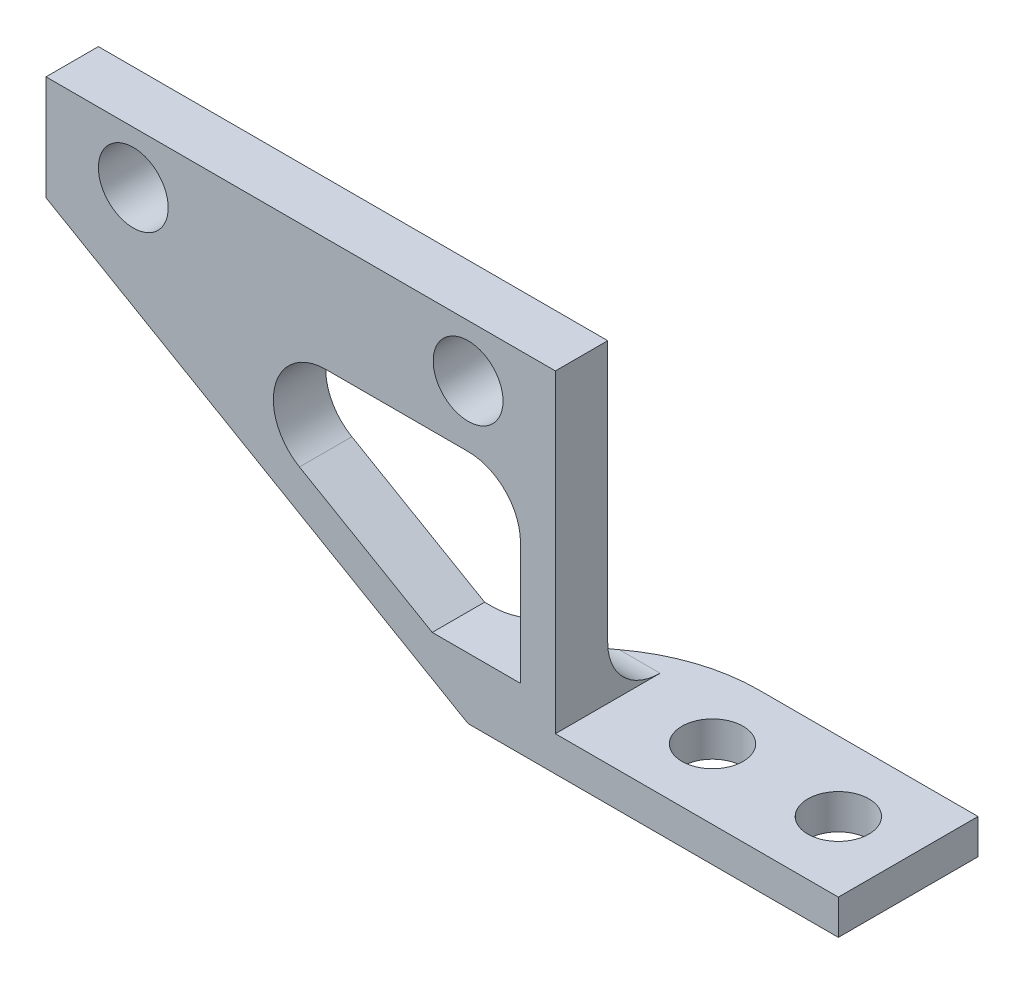
ISO-10303-21;
HEADER;
FILE_DESCRIPTION(('STEP AP214'),'2;1');
FILE_NAME('part.step','',(''),(''),'','','');
FILE_SCHEMA(('AUTOMOTIVE_DESIGN { 1 0 10303 214 1 1 1 1 }'));
ENDSEC;
DATA;
#1=APPLICATION_CONTEXT('core data for automotive mechanical design processes');
#2=APPLICATION_PROTOCOL_DEFINITION('international standard','automotive_design',2000,#1);
#3=PRODUCT_CONTEXT('',#1,'mechanical');
#4=PRODUCT('Part','Part','',(#3));
#5=PRODUCT_RELATED_PRODUCT_CATEGORY('part','',(#4));
#6=PRODUCT_DEFINITION_FORMATION('','',#4);
#7=PRODUCT_DEFINITION_CONTEXT('part definition',#1,'design');
#8=PRODUCT_DEFINITION('design','',#6,#7);
#9=PRODUCT_DEFINITION_SHAPE('','',#8);
#10=(LENGTH_UNIT() NAMED_UNIT(*) SI_UNIT(.MILLI.,.METRE.));
#11=(NAMED_UNIT(*) PLANE_ANGLE_UNIT() SI_UNIT($,.RADIAN.));
#12=(NAMED_UNIT(*) SI_UNIT($,.STERADIAN.) SOLID_ANGLE_UNIT());
#13=UNCERTAINTY_MEASURE_WITH_UNIT(LENGTH_MEASURE(1.E-05),#10,'distance_accuracy_value','');
#14=(GEOMETRIC_REPRESENTATION_CONTEXT(3) GLOBAL_UNCERTAINTY_ASSIGNED_CONTEXT((#13)) GLOBAL_UNIT_ASSIGNED_CONTEXT((#10,
#11,#12)) REPRESENTATION_CONTEXT('',''));
#15=CARTESIAN_POINT('',(0.,0.,0.));
#16=DIRECTION('',(0.,0.,1.));
#17=DIRECTION('',(1.,0.,0.));
#18=AXIS2_PLACEMENT_3D('',#15,#16,#17);
#19=CARTESIAN_POINT('',(0.,2.,0.));
#20=DIRECTION('',(0.,-1.,0.));
#21=DIRECTION('',(0.,0.,-1.));
#22=AXIS2_PLACEMENT_3D('',#19,#20,#21);
#23=PLANE('',#22);
#24=CARTESIAN_POINT('',(8.66025403784439,2.,2.));
#25=DIRECTION('',(0.,-1.,0.));
#26=DIRECTION('',(0.,0.,-1.));
#27=AXIS2_PLACEMENT_3D('',#24,#25,#26);
#28=CIRCLE('',#27,10.);
#29=CARTESIAN_POINT('',(8.66025403784439,2.,-8.));
#30=VERTEX_POINT('',#29);
#31=CARTESIAN_POINT('',(2.66025403784438,2.,-6.));
#32=VERTEX_POINT('',#31);
#33=EDGE_CURVE('E319',#30,#32,#28,.F.);
#34=ORIENTED_EDGE('',*,*,#33,.T.);
#35=DIRECTION('',(-1.,0.,0.));
#36=VECTOR('',#35,1.);
#37=CARTESIAN_POINT('',(5.,2.,-6.));
#38=LINE('',#37,#36);
#39=CARTESIAN_POINT('',(5.,2.,-6.));
#40=VERTEX_POINT('',#39);
#41=EDGE_CURVE('E345',#32,#40,#38,.F.);
#42=ORIENTED_EDGE('',*,*,#41,.T.);
#43=DIRECTION('',(0.,0.,1.));
#44=VECTOR('',#43,1.);
#45=CARTESIAN_POINT('',(5.,2.,0.));
#46=LINE('',#45,#44);
#47=CARTESIAN_POINT('',(5.,2.,0.));
#48=VERTEX_POINT('',#47);
#49=EDGE_CURVE('E256',#40,#48,#46,.T.);
#50=ORIENTED_EDGE('',*,*,#49,.T.);
#51=DIRECTION('',(1.,0.,0.));
#52=VECTOR('',#51,1.);
#53=CARTESIAN_POINT('',(0.,2.,0.));
#54=LINE('',#53,#52);
#55=CARTESIAN_POINT('',(21.21,2.,0.));
#56=VERTEX_POINT('',#55);
#57=EDGE_CURVE('E286',#48,#56,#54,.T.);
#58=ORIENTED_EDGE('',*,*,#57,.T.);
#59=DIRECTION('',(0.,0.,-1.));
#60=VECTOR('',#59,1.);
#61=CARTESIAN_POINT('',(21.21,2.,0.));
#62=LINE('',#61,#60);
#63=CARTESIAN_POINT('',(21.21,2.,-8.));
#64=VERTEX_POINT('',#63);
#65=EDGE_CURVE('E289',#56,#64,#62,.T.);
#66=ORIENTED_EDGE('',*,*,#65,.T.);
#67=DIRECTION('',(-1.,0.,0.));
#68=VECTOR('',#67,1.);
#69=CARTESIAN_POINT('',(0.,2.,-8.00000000000001));
#70=LINE('',#69,#68);
#71=EDGE_CURVE('E293',#64,#30,#70,.T.);
#72=ORIENTED_EDGE('',*,*,#71,.T.);
#73=EDGE_LOOP('',(#34,#42,#50,#58,#66,#72));
#74=FACE_BOUND('',#73,.T.);
#75=CARTESIAN_POINT('',(10.,2.,-4.));
#76=DIRECTION('',(0.,1.,0.));
#77=DIRECTION('',(0.,0.,1.));
#78=AXIS2_PLACEMENT_3D('',#75,#76,#77);
#79=CIRCLE('',#78,1.75);
#80=CARTESIAN_POINT('',(10.,2.,-2.25));
#81=VERTEX_POINT('',#80);
#82=EDGE_CURVE('E278',#81,#81,#79,.T.);
#83=ORIENTED_EDGE('',*,*,#82,.F.);
#84=EDGE_LOOP('',(#83));
#85=FACE_BOUND('',#84,.T.);
#86=CARTESIAN_POINT('',(17.21,2.,-4.));
#87=DIRECTION('',(0.,1.,0.));
#88=DIRECTION('',(0.,0.,1.));
#89=AXIS2_PLACEMENT_3D('',#86,#87,#88);
#90=CIRCLE('',#89,1.75);
#91=CARTESIAN_POINT('',(17.21,2.,-2.25));
#92=VERTEX_POINT('',#91);
#93=EDGE_CURVE('E270',#92,#92,#90,.T.);
#94=ORIENTED_EDGE('',*,*,#93,.F.);
#95=EDGE_LOOP('',(#94));
#96=FACE_BOUND('',#95,.T.);
#97=ADVANCED_FACE('F41',(#74,#85,#96),#23,.F.);
#98=CARTESIAN_POINT('',(0.,0.,0.));
#99=DIRECTION('',(0.,-1.,0.));
#100=DIRECTION('',(0.,0.,-1.));
#101=AXIS2_PLACEMENT_3D('',#98,#99,#100);
#102=PLANE('',#101);
#103=DIRECTION('',(0.,0.,1.));
#104=VECTOR('',#103,1.);
#105=CARTESIAN_POINT('',(0.,0.,-3.));
#106=LINE('',#105,#104);
#107=CARTESIAN_POINT('',(0.,0.,-3.4539455047096));
#108=VERTEX_POINT('',#107);
#109=CARTESIAN_POINT('',(0.,0.,0.));
#110=VERTEX_POINT('',#109);
#111=EDGE_CURVE('E67',#108,#110,#106,.T.);
#112=ORIENTED_EDGE('',*,*,#111,.F.);
#113=CARTESIAN_POINT('',(-1.58669672811521,0.,-6.));
#114=DIRECTION('',(0.,-1.,0.));
#115=DIRECTION('',(0.,0.,-1.));
#116=AXIS2_PLACEMENT_3D('',#113,#114,#115);
#117=CIRCLE('',#116,3.);
#118=CARTESIAN_POINT('',(0.777984217875463,0.,-4.15384615384616));
#119=VERTEX_POINT('',#118);
#120=EDGE_CURVE('E363',#108,#119,#117,.F.);
#121=ORIENTED_EDGE('',*,*,#120,.T.);
#122=CARTESIAN_POINT('',(8.66025403784439,0.,2.));
#123=DIRECTION('',(0.,-1.,0.));
#124=DIRECTION('',(0.,0.,-1.));
#125=AXIS2_PLACEMENT_3D('',#122,#123,#124);
#126=CIRCLE('',#125,10.);
#127=CARTESIAN_POINT('',(8.66025403784439,0.,-8.));
#128=VERTEX_POINT('',#127);
#129=EDGE_CURVE('E313',#119,#128,#126,.T.);
#130=ORIENTED_EDGE('',*,*,#129,.T.);
#131=DIRECTION('',(-1.,0.,0.));
#132=VECTOR('',#131,1.);
#133=CARTESIAN_POINT('',(0.,0.,-8.00000000000001));
#134=LINE('',#133,#132);
#135=CARTESIAN_POINT('',(21.21,0.,-8.));
#136=VERTEX_POINT('',#135);
#137=EDGE_CURVE('E290',#136,#128,#134,.T.);
#138=ORIENTED_EDGE('',*,*,#137,.F.);
#139=DIRECTION('',(0.,0.,-1.));
#140=VECTOR('',#139,1.);
#141=CARTESIAN_POINT('',(21.21,0.,0.));
#142=LINE('',#141,#140);
#143=CARTESIAN_POINT('',(21.21,0.,0.));
#144=VERTEX_POINT('',#143);
#145=EDGE_CURVE('E300',#144,#136,#142,.T.);
#146=ORIENTED_EDGE('',*,*,#145,.F.);
#147=DIRECTION('',(1.,0.,0.));
#148=VECTOR('',#147,1.);
#149=CARTESIAN_POINT('',(0.,0.,0.));
#150=LINE('',#149,#148);
#151=EDGE_CURVE('E282',#110,#144,#150,.T.);
#152=ORIENTED_EDGE('',*,*,#151,.F.);
#153=EDGE_LOOP('',(#112,#121,#130,#138,#146,#152));
#154=FACE_BOUND('',#153,.T.);
#155=CARTESIAN_POINT('',(10.,0.,-4.));
#156=DIRECTION('',(0.,1.,0.));
#157=DIRECTION('',(0.,0.,1.));
#158=AXIS2_PLACEMENT_3D('',#155,#156,#157);
#159=CIRCLE('',#158,1.75);
#160=CARTESIAN_POINT('',(10.,0.,-2.25));
#161=VERTEX_POINT('',#160);
#162=EDGE_CURVE('E274',#161,#161,#159,.T.);
#163=ORIENTED_EDGE('',*,*,#162,.T.);
#164=EDGE_LOOP('',(#163));
#165=FACE_BOUND('',#164,.T.);
#166=CARTESIAN_POINT('',(17.21,0.,-4.));
#167=DIRECTION('',(0.,1.,0.));
#168=DIRECTION('',(0.,0.,1.));
#169=AXIS2_PLACEMENT_3D('',#166,#167,#168);
#170=CIRCLE('',#169,1.75);
#171=CARTESIAN_POINT('',(17.21,0.,-2.25));
#172=VERTEX_POINT('',#171);
#173=EDGE_CURVE('E269',#172,#172,#170,.T.);
#174=ORIENTED_EDGE('',*,*,#173,.T.);
#175=EDGE_LOOP('',(#174));
#176=FACE_BOUND('',#175,.T.);
#177=ADVANCED_FACE('F405',(#154,#165,#176),#102,.T.);
#178=CARTESIAN_POINT('',(0.,2.,0.));
#179=DIRECTION('',(0.,0.,-1.));
#180=DIRECTION('',(-1.,0.,0.));
#181=AXIS2_PLACEMENT_3D('',#178,#179,#180);
#182=PLANE('',#181);
#183=ORIENTED_EDGE('',*,*,#57,.F.);
#184=DIRECTION('',(0.,1.,0.));
#185=VECTOR('',#184,1.);
#186=CARTESIAN_POINT('',(5.,0.,0.));
#187=LINE('',#186,#185);
#188=CARTESIAN_POINT('',(5.,20.,0.));
#189=VERTEX_POINT('',#188);
#190=EDGE_CURVE('E192',#48,#189,#187,.T.);
#191=ORIENTED_EDGE('',*,*,#190,.T.);
#192=DIRECTION('',(-1.,0.,0.));
#193=VECTOR('',#192,1.);
#194=CARTESIAN_POINT('',(5.,20.,0.));
#195=LINE('',#194,#193);
#196=CARTESIAN_POINT('',(-24.18,20.,0.));
#197=VERTEX_POINT('',#196);
#198=EDGE_CURVE('E244',#189,#197,#195,.T.);
#199=ORIENTED_EDGE('',*,*,#198,.T.);
#200=DIRECTION('',(0.,-1.,0.));
#201=VECTOR('',#200,1.);
#202=CARTESIAN_POINT('',(-24.18,20.,0.));
#203=LINE('',#202,#201);
#204=CARTESIAN_POINT('',(-24.18,14.,0.));
#205=VERTEX_POINT('',#204);
#206=EDGE_CURVE('E248',#197,#205,#203,.T.);
#207=ORIENTED_EDGE('',*,*,#206,.T.);
#208=DIRECTION('',(0.865409949190217,-0.50106448671063,0.));
#209=VECTOR('',#208,1.);
#210=CARTESIAN_POINT('',(0.,0.,0.));
#211=LINE('',#210,#209);
#212=EDGE_CURVE('E229',#205,#110,#211,.T.);
#213=ORIENTED_EDGE('',*,*,#212,.T.);
#214=ORIENTED_EDGE('',*,*,#151,.T.);
#215=DIRECTION('',(0.,-1.,0.));
#216=VECTOR('',#215,1.);
#217=CARTESIAN_POINT('',(21.21,2.,0.));
#218=LINE('',#217,#216);
#219=EDGE_CURVE('E309',#56,#144,#218,.T.);
#220=ORIENTED_EDGE('',*,*,#219,.F.);
#221=EDGE_LOOP('',(#183,#191,#199,#207,#213,#214,#220));
#222=FACE_BOUND('',#221,.T.);
#223=DIRECTION('',(1.,0.,0.));
#224=VECTOR('',#223,1.);
#225=CARTESIAN_POINT('',(3.,3.5,0.));
#226=LINE('',#225,#224);
#227=CARTESIAN_POINT('',(-2.05349780209025,3.5,0.));
#228=VERTEX_POINT('',#227);
#229=CARTESIAN_POINT('',(3.,3.5,0.));
#230=VERTEX_POINT('',#229);
#231=EDGE_CURVE('E212',#228,#230,#226,.T.);
#232=ORIENTED_EDGE('',*,*,#231,.F.);
#233=DIRECTION('',(0.865409949190217,-0.50106448671063,0.));
#234=VECTOR('',#233,1.);
#235=CARTESIAN_POINT('',(-2.05349780209025,3.5,0.));
#236=LINE('',#235,#234);
#237=CARTESIAN_POINT('',(-9.65943796535752,7.90377015242935,0.));
#238=VERTEX_POINT('',#237);
#239=EDGE_CURVE('E189',#238,#228,#236,.T.);
#240=ORIENTED_EDGE('',*,*,#239,.F.);
#241=CARTESIAN_POINT('',(-8.15624450522563,10.5,0.));
#242=DIRECTION('',(0.,0.,-1.));
#243=DIRECTION('',(-1.,0.,0.));
#244=AXIS2_PLACEMENT_3D('',#241,#242,#243);
#245=CIRCLE('',#244,3.);
#246=CARTESIAN_POINT('',(-8.15624450522563,13.5,0.));
#247=VERTEX_POINT('',#246);
#248=EDGE_CURVE('E355',#238,#247,#245,.T.);
#249=ORIENTED_EDGE('',*,*,#248,.T.);
#250=DIRECTION('',(-1.,0.,0.));
#251=VECTOR('',#250,1.);
#252=CARTESIAN_POINT('',(-19.3249263735188,13.5,0.));
#253=LINE('',#252,#251);
#254=CARTESIAN_POINT('',(0.,13.5,0.));
#255=VERTEX_POINT('',#254);
#256=EDGE_CURVE('E204',#255,#247,#253,.T.);
#257=ORIENTED_EDGE('',*,*,#256,.F.);
#258=CARTESIAN_POINT('',(0.,10.5,0.));
#259=DIRECTION('',(0.,0.,-1.));
#260=DIRECTION('',(-1.,0.,0.));
#261=AXIS2_PLACEMENT_3D('',#258,#259,#260);
#262=CIRCLE('',#261,3.);
#263=CARTESIAN_POINT('',(3.,10.5,0.));
#264=VERTEX_POINT('',#263);
#265=EDGE_CURVE('E349',#255,#264,#262,.T.);
#266=ORIENTED_EDGE('',*,*,#265,.T.);
#267=DIRECTION('',(0.,1.,0.));
#268=VECTOR('',#267,1.);
#269=CARTESIAN_POINT('',(3.,13.5,0.));
#270=LINE('',#269,#268);
#271=EDGE_CURVE('E215',#230,#264,#270,.T.);
#272=ORIENTED_EDGE('',*,*,#271,.F.);
#273=EDGE_LOOP('',(#232,#240,#249,#257,#266,#272));
#274=FACE_BOUND('',#273,.T.);
#275=CARTESIAN_POINT('',(-19.18,17.,0.));
#276=DIRECTION('',(0.,0.,1.));
#277=DIRECTION('',(1.,0.,0.));
#278=AXIS2_PLACEMENT_3D('',#275,#276,#277);
#279=CIRCLE('',#278,2.);
#280=CARTESIAN_POINT('',(-17.18,17.,0.));
#281=VERTEX_POINT('',#280);
#282=EDGE_CURVE('E207',#281,#281,#279,.T.);
#283=ORIENTED_EDGE('',*,*,#282,.F.);
#284=EDGE_LOOP('',(#283));
#285=FACE_BOUND('',#284,.T.);
#286=CARTESIAN_POINT('',(0.,17.,0.));
#287=DIRECTION('',(0.,0.,1.));
#288=DIRECTION('',(1.,0.,0.));
#289=AXIS2_PLACEMENT_3D('',#286,#287,#288);
#290=CIRCLE('',#289,2.);
#291=CARTESIAN_POINT('',(2.,17.,0.));
#292=VERTEX_POINT('',#291);
#293=EDGE_CURVE('E443',#292,#292,#290,.T.);
#294=ORIENTED_EDGE('',*,*,#293,.F.);
#295=EDGE_LOOP('',(#294));
#296=FACE_BOUND('',#295,.T.);
#297=ADVANCED_FACE('F388',(#222,#274,#285,#296),#182,.F.);
#298=CARTESIAN_POINT('',(21.21,2.,0.));
#299=DIRECTION('',(-1.,0.,0.));
#300=DIRECTION('',(0.,0.,1.));
#301=AXIS2_PLACEMENT_3D('',#298,#299,#300);
#302=PLANE('',#301);
#303=ORIENTED_EDGE('',*,*,#145,.T.);
#304=DIRECTION('',(0.,-1.,0.));
#305=VECTOR('',#304,1.);
#306=CARTESIAN_POINT('',(21.21,2.,-8.));
#307=LINE('',#306,#305);
#308=EDGE_CURVE('E297',#64,#136,#307,.T.);
#309=ORIENTED_EDGE('',*,*,#308,.F.);
#310=ORIENTED_EDGE('',*,*,#65,.F.);
#311=ORIENTED_EDGE('',*,*,#219,.T.);
#312=EDGE_LOOP('',(#303,#309,#310,#311));
#313=FACE_BOUND('',#312,.T.);
#314=ADVANCED_FACE('F419',(#313),#302,.F.);
#315=CARTESIAN_POINT('',(0.,2.,-8.00000000000001));
#316=DIRECTION('',(0.,0.,1.));
#317=DIRECTION('',(1.,0.,0.));
#318=AXIS2_PLACEMENT_3D('',#315,#316,#317);
#319=PLANE('',#318);
#320=ORIENTED_EDGE('',*,*,#137,.T.);
#321=DIRECTION('',(0.,-1.,0.));
#322=VECTOR('',#321,1.);
#323=CARTESIAN_POINT('',(8.66025403784439,2.,-8.));
#324=LINE('',#323,#322);
#325=EDGE_CURVE('E316',#128,#30,#324,.F.);
#326=ORIENTED_EDGE('',*,*,#325,.T.);
#327=ORIENTED_EDGE('',*,*,#71,.F.);
#328=ORIENTED_EDGE('',*,*,#308,.T.);
#329=EDGE_LOOP('',(#320,#326,#327,#328));
#330=FACE_BOUND('',#329,.T.);
#331=ADVANCED_FACE('F417',(#330),#319,.F.);
#332=CARTESIAN_POINT('',(10.,2.,-4.));
#333=DIRECTION('',(0.,-1.,0.));
#334=DIRECTION('',(0.,0.,-1.));
#335=AXIS2_PLACEMENT_3D('',#332,#333,#334);
#336=CYLINDRICAL_SURFACE('',#335,1.75);
#337=ORIENTED_EDGE('',*,*,#82,.T.);
#338=EDGE_LOOP('',(#337));
#339=FACE_BOUND('',#338,.T.);
#340=ORIENTED_EDGE('',*,*,#162,.F.);
#341=EDGE_LOOP('',(#340));
#342=FACE_BOUND('',#341,.T.);
#343=ADVANCED_FACE('F414',(#339,#342),#336,.F.);
#344=CARTESIAN_POINT('',(17.21,2.,-4.));
#345=DIRECTION('',(0.,-1.,0.));
#346=DIRECTION('',(0.,0.,-1.));
#347=AXIS2_PLACEMENT_3D('',#344,#345,#346);
#348=CYLINDRICAL_SURFACE('',#347,1.75);
#349=ORIENTED_EDGE('',*,*,#93,.T.);
#350=EDGE_LOOP('',(#349));
#351=FACE_BOUND('',#350,.T.);
#352=ORIENTED_EDGE('',*,*,#173,.F.);
#353=EDGE_LOOP('',(#352));
#354=FACE_BOUND('',#353,.T.);
#355=ADVANCED_FACE('F489',(#351,#354),#348,.F.);
#356=CARTESIAN_POINT('',(0.,0.,-3.));
#357=DIRECTION('',(0.,0.,1.));
#358=DIRECTION('',(1.,0.,0.));
#359=AXIS2_PLACEMENT_3D('',#356,#357,#358);
#360=PLANE('',#359);
#361=CARTESIAN_POINT('',(0.,17.,-3.));
#362=DIRECTION('',(0.,0.,1.));
#363=DIRECTION('',(1.,0.,0.));
#364=AXIS2_PLACEMENT_3D('',#361,#362,#363);
#365=CIRCLE('',#364,2.);
#366=CARTESIAN_POINT('',(2.,17.,-3.));
#367=VERTEX_POINT('',#366);
#368=EDGE_CURVE('E446',#367,#367,#365,.T.);
#369=ORIENTED_EDGE('',*,*,#368,.T.);
#370=EDGE_LOOP('',(#369));
#371=FACE_BOUND('',#370,.T.);
#372=CARTESIAN_POINT('',(-19.18,17.,-3.));
#373=DIRECTION('',(0.,0.,1.));
#374=DIRECTION('',(1.,0.,0.));
#375=AXIS2_PLACEMENT_3D('',#372,#373,#374);
#376=CIRCLE('',#375,2.);
#377=CARTESIAN_POINT('',(-17.18,17.,-3.));
#378=VERTEX_POINT('',#377);
#379=EDGE_CURVE('E216',#378,#378,#376,.T.);
#380=ORIENTED_EDGE('',*,*,#379,.T.);
#381=EDGE_LOOP('',(#380));
#382=FACE_BOUND('',#381,.T.);
#383=DIRECTION('',(1.,0.,0.));
#384=VECTOR('',#383,1.);
#385=CARTESIAN_POINT('',(3.,3.5,-3.));
#386=LINE('',#385,#384);
#387=CARTESIAN_POINT('',(-2.05349780209025,3.5,-3.));
#388=VERTEX_POINT('',#387);
#389=CARTESIAN_POINT('',(-1.58669672811521,3.5,-3.));
#390=VERTEX_POINT('',#389);
#391=EDGE_CURVE('E174',#388,#390,#386,.T.);
#392=ORIENTED_EDGE('',*,*,#391,.T.);
#393=DIRECTION('',(0.,-1.,0.));
#394=VECTOR('',#393,1.);
#395=CARTESIAN_POINT('',(-1.58669672811521,0.,-3.));
#396=LINE('',#395,#394);
#397=CARTESIAN_POINT('',(-1.58669672811521,0.918682969132051,-3.));
#398=VERTEX_POINT('',#397);
#399=EDGE_CURVE('E339',#390,#398,#396,.T.);
#400=ORIENTED_EDGE('',*,*,#399,.T.);
#401=DIRECTION('',(0.865409949190217,-0.50106448671063,0.));
#402=VECTOR('',#401,1.);
#403=CARTESIAN_POINT('',(0.,0.,-3.));
#404=LINE('',#403,#402);
#405=CARTESIAN_POINT('',(-24.18,14.,-3.));
#406=VERTEX_POINT('',#405);
#407=EDGE_CURVE('E237',#406,#398,#404,.T.);
#408=ORIENTED_EDGE('',*,*,#407,.F.);
#409=DIRECTION('',(0.,-1.,0.));
#410=VECTOR('',#409,1.);
#411=CARTESIAN_POINT('',(-24.18,20.,-3.));
#412=LINE('',#411,#410);
#413=CARTESIAN_POINT('',(-24.18,20.,-3.));
#414=VERTEX_POINT('',#413);
#415=EDGE_CURVE('E233',#414,#406,#412,.T.);
#416=ORIENTED_EDGE('',*,*,#415,.F.);
#417=DIRECTION('',(-1.,0.,0.));
#418=VECTOR('',#417,1.);
#419=CARTESIAN_POINT('',(5.,20.,-3.));
#420=LINE('',#419,#418);
#421=CARTESIAN_POINT('',(5.,20.,-3.));
#422=VERTEX_POINT('',#421);
#423=EDGE_CURVE('E228',#422,#414,#420,.T.);
#424=ORIENTED_EDGE('',*,*,#423,.F.);
#425=DIRECTION('',(0.,1.,0.));
#426=VECTOR('',#425,1.);
#427=CARTESIAN_POINT('',(5.,0.,-3.));
#428=LINE('',#427,#426);
#429=CARTESIAN_POINT('',(5.,5.,-3.));
#430=VERTEX_POINT('',#429);
#431=EDGE_CURVE('E225',#430,#422,#428,.T.);
#432=ORIENTED_EDGE('',*,*,#431,.F.);
#433=DIRECTION('',(-1.,0.,0.));
#434=VECTOR('',#433,1.);
#435=CARTESIAN_POINT('',(0.,5.,-3.));
#436=LINE('',#435,#434);
#437=CARTESIAN_POINT('',(3.,5.,-3.));
#438=VERTEX_POINT('',#437);
#439=EDGE_CURVE('E336',#430,#438,#436,.T.);
#440=ORIENTED_EDGE('',*,*,#439,.T.);
#441=DIRECTION('',(0.,1.,0.));
#442=VECTOR('',#441,1.);
#443=CARTESIAN_POINT('',(3.,13.5,-3.));
#444=LINE('',#443,#442);
#445=CARTESIAN_POINT('',(3.,10.5,-3.));
#446=VERTEX_POINT('',#445);
#447=EDGE_CURVE('E198',#438,#446,#444,.T.);
#448=ORIENTED_EDGE('',*,*,#447,.T.);
#449=CARTESIAN_POINT('',(0.,10.5,-3.));
#450=DIRECTION('',(0.,0.,1.));
#451=DIRECTION('',(1.,0.,0.));
#452=AXIS2_PLACEMENT_3D('',#449,#450,#451);
#453=CIRCLE('',#452,3.);
#454=CARTESIAN_POINT('',(0.,13.5,-3.));
#455=VERTEX_POINT('',#454);
#456=EDGE_CURVE('E352',#446,#455,#453,.T.);
#457=ORIENTED_EDGE('',*,*,#456,.T.);
#458=DIRECTION('',(-1.,0.,0.));
#459=VECTOR('',#458,1.);
#460=CARTESIAN_POINT('',(-19.3249263735188,13.5,-3.));
#461=LINE('',#460,#459);
#462=CARTESIAN_POINT('',(-8.15624450522563,13.5,-3.));
#463=VERTEX_POINT('',#462);
#464=EDGE_CURVE('E183',#455,#463,#461,.T.);
#465=ORIENTED_EDGE('',*,*,#464,.T.);
#466=CARTESIAN_POINT('',(-8.15624450522563,10.5,-3.));
#467=DIRECTION('',(0.,0.,1.));
#468=DIRECTION('',(1.,0.,0.));
#469=AXIS2_PLACEMENT_3D('',#466,#467,#468);
#470=CIRCLE('',#469,3.);
#471=CARTESIAN_POINT('',(-9.65943796535752,7.90377015242935,-3.));
#472=VERTEX_POINT('',#471);
#473=EDGE_CURVE('E178',#463,#472,#470,.T.);
#474=ORIENTED_EDGE('',*,*,#473,.T.);
#475=DIRECTION('',(0.865409949190217,-0.50106448671063,0.));
#476=VECTOR('',#475,1.);
#477=CARTESIAN_POINT('',(-2.05349780209025,3.5,-3.));
#478=LINE('',#477,#476);
#479=EDGE_CURVE('E169',#472,#388,#478,.T.);
#480=ORIENTED_EDGE('',*,*,#479,.T.);
#481=EDGE_LOOP('',(#392,#400,#408,#416,#424,#432,#440,#448,#457,#465,#474,#480));
#482=FACE_BOUND('',#481,.T.);
#483=ADVANCED_FACE('F171',(#371,#382,#482),#360,.F.);
#484=CARTESIAN_POINT('',(5.,0.,-3.));
#485=DIRECTION('',(1.,0.,0.));
#486=DIRECTION('',(0.,0.,-1.));
#487=AXIS2_PLACEMENT_3D('',#484,#485,#486);
#488=PLANE('',#487);
#489=ORIENTED_EDGE('',*,*,#49,.F.);
#490=CARTESIAN_POINT('',(5.,5.,-6.));
#491=DIRECTION('',(1.,0.,0.));
#492=DIRECTION('',(0.,0.,-1.));
#493=AXIS2_PLACEMENT_3D('',#490,#491,#492);
#494=CIRCLE('',#493,3.);
#495=EDGE_CURVE('E11',#40,#430,#494,.F.);
#496=ORIENTED_EDGE('',*,*,#495,.T.);
#497=ORIENTED_EDGE('',*,*,#431,.T.);
#498=DIRECTION('',(0.,0.,1.));
#499=VECTOR('',#498,1.);
#500=CARTESIAN_POINT('',(5.,20.,-3.));
#501=LINE('',#500,#499);
#502=EDGE_CURVE('E241',#422,#189,#501,.T.);
#503=ORIENTED_EDGE('',*,*,#502,.T.);
#504=ORIENTED_EDGE('',*,*,#190,.F.);
#505=EDGE_LOOP('',(#489,#496,#497,#503,#504));
#506=FACE_BOUND('',#505,.T.);
#507=ADVANCED_FACE('F488',(#506),#488,.T.);
#508=CARTESIAN_POINT('',(0.,0.,-3.));
#509=DIRECTION('',(-0.50106448671063,-0.865409949190216,0.));
#510=DIRECTION('',(0.865409949190217,-0.50106448671063,0.));
#511=AXIS2_PLACEMENT_3D('',#508,#509,#510);
#512=PLANE('',#511);
#513=ORIENTED_EDGE('',*,*,#212,.F.);
#514=DIRECTION('',(0.,0.,1.));
#515=VECTOR('',#514,1.);
#516=CARTESIAN_POINT('',(-24.18,14.,-3.));
#517=LINE('',#516,#515);
#518=EDGE_CURVE('E257',#406,#205,#517,.T.);
#519=ORIENTED_EDGE('',*,*,#518,.F.);
#520=ORIENTED_EDGE('',*,*,#407,.T.);
#521=CARTESIAN_POINT('',(-1.58669672811521,0.918682969132051,-6.));
#522=DIRECTION('',(-0.50106448671063,-0.865409949190216,0.));
#523=DIRECTION('',(0.865409949190217,-0.50106448671063,0.));
#524=AXIS2_PLACEMENT_3D('',#521,#522,#523);
#525=ELLIPSE('',#524,3.46656518428887,3.);
#526=EDGE_CURVE('E360',#398,#108,#525,.F.);
#527=ORIENTED_EDGE('',*,*,#526,.T.);
#528=ORIENTED_EDGE('',*,*,#111,.T.);
#529=EDGE_LOOP('',(#513,#519,#520,#527,#528));
#530=FACE_BOUND('',#529,.T.);
#531=ADVANCED_FACE('F491',(#530),#512,.T.);
#532=CARTESIAN_POINT('',(-24.18,20.,-3.));
#533=DIRECTION('',(-1.,0.,0.));
#534=DIRECTION('',(0.,0.,1.));
#535=AXIS2_PLACEMENT_3D('',#532,#533,#534);
#536=PLANE('',#535);
#537=ORIENTED_EDGE('',*,*,#206,.F.);
#538=DIRECTION('',(0.,0.,1.));
#539=VECTOR('',#538,1.);
#540=CARTESIAN_POINT('',(-24.18,20.,-3.));
#541=LINE('',#540,#539);
#542=EDGE_CURVE('E260',#414,#197,#541,.T.);
#543=ORIENTED_EDGE('',*,*,#542,.F.);
#544=ORIENTED_EDGE('',*,*,#415,.T.);
#545=ORIENTED_EDGE('',*,*,#518,.T.);
#546=EDGE_LOOP('',(#537,#543,#544,#545));
#547=FACE_BOUND('',#546,.T.);
#548=ADVANCED_FACE('F494',(#547),#536,.T.);
#549=CARTESIAN_POINT('',(5.,20.,-3.));
#550=DIRECTION('',(0.,1.,0.));
#551=DIRECTION('',(-1.,0.,0.));
#552=AXIS2_PLACEMENT_3D('',#549,#550,#551);
#553=PLANE('',#552);
#554=ORIENTED_EDGE('',*,*,#198,.F.);
#555=ORIENTED_EDGE('',*,*,#502,.F.);
#556=ORIENTED_EDGE('',*,*,#423,.T.);
#557=ORIENTED_EDGE('',*,*,#542,.T.);
#558=EDGE_LOOP('',(#554,#555,#556,#557));
#559=FACE_BOUND('',#558,.T.);
#560=ADVANCED_FACE('F485',(#559),#553,.T.);
#561=CARTESIAN_POINT('',(3.,3.5,-3.));
#562=DIRECTION('',(0.,-1.,0.));
#563=DIRECTION('',(1.,0.,0.));
#564=AXIS2_PLACEMENT_3D('',#561,#562,#563);
#565=PLANE('',#564);
#566=ORIENTED_EDGE('',*,*,#231,.T.);
#567=DIRECTION('',(0.,0.,1.));
#568=VECTOR('',#567,1.);
#569=CARTESIAN_POINT('',(3.,3.5,-3.));
#570=LINE('',#569,#568);
#571=CARTESIAN_POINT('',(3.,3.5,-3.40192378864668));
#572=VERTEX_POINT('',#571);
#573=EDGE_CURVE('E59',#572,#230,#570,.T.);
#574=ORIENTED_EDGE('',*,*,#573,.F.);
#575=DIRECTION('',(1.,0.,0.));
#576=VECTOR('',#575,1.);
#577=CARTESIAN_POINT('',(3.,3.5,-3.40192378864668));
#578=LINE('',#577,#576);
#579=CARTESIAN_POINT('',(-0.0866967281152136,3.5,-3.40192378864668));
#580=VERTEX_POINT('',#579);
#581=EDGE_CURVE('E371',#572,#580,#578,.F.);
#582=ORIENTED_EDGE('',*,*,#581,.T.);
#583=CARTESIAN_POINT('',(-1.58669672811521,3.5,-6.));
#584=DIRECTION('',(0.,-1.,0.));
#585=DIRECTION('',(1.,0.,0.));
#586=AXIS2_PLACEMENT_3D('',#583,#584,#585);
#587=CIRCLE('',#586,3.);
#588=EDGE_CURVE('E196',#580,#390,#587,.T.);
#589=ORIENTED_EDGE('',*,*,#588,.T.);
#590=ORIENTED_EDGE('',*,*,#391,.F.);
#591=DIRECTION('',(0.,0.,1.));
#592=VECTOR('',#591,1.);
#593=CARTESIAN_POINT('',(-2.05349780209025,3.5,-3.));
#594=LINE('',#593,#592);
#595=EDGE_CURVE('E186',#388,#228,#594,.T.);
#596=ORIENTED_EDGE('',*,*,#595,.T.);
#597=EDGE_LOOP('',(#566,#574,#582,#589,#590,#596));
#598=FACE_BOUND('',#597,.T.);
#599=ADVANCED_FACE('F194',(#598),#565,.F.);
#600=CARTESIAN_POINT('',(-2.05349780209025,3.5,-3.));
#601=DIRECTION('',(-0.50106448671063,-0.865409949190217,0.));
#602=DIRECTION('',(0.865409949190217,-0.50106448671063,0.));
#603=AXIS2_PLACEMENT_3D('',#600,#601,#602);
#604=PLANE('',#603);
#605=ORIENTED_EDGE('',*,*,#479,.F.);
#606=DIRECTION('',(0.,0.,1.));
#607=VECTOR('',#606,1.);
#608=CARTESIAN_POINT('',(-9.65943796535752,7.90377015242935,0.));
#609=LINE('',#608,#607);
#610=EDGE_CURVE('E333',#472,#238,#609,.T.);
#611=ORIENTED_EDGE('',*,*,#610,.T.);
#612=ORIENTED_EDGE('',*,*,#239,.T.);
#613=ORIENTED_EDGE('',*,*,#595,.F.);
#614=EDGE_LOOP('',(#605,#611,#612,#613));
#615=FACE_BOUND('',#614,.T.);
#616=ADVANCED_FACE('F187',(#615),#604,.F.);
#617=CARTESIAN_POINT('',(-19.3249263735188,13.5,-3.));
#618=DIRECTION('',(0.,1.,0.));
#619=DIRECTION('',(0.,0.,1.));
#620=AXIS2_PLACEMENT_3D('',#617,#618,#619);
#621=PLANE('',#620);
#622=ORIENTED_EDGE('',*,*,#464,.F.);
#623=DIRECTION('',(0.,0.,1.));
#624=VECTOR('',#623,1.);
#625=CARTESIAN_POINT('',(0.,13.5,0.));
#626=LINE('',#625,#624);
#627=EDGE_CURVE('E326',#455,#255,#626,.T.);
#628=ORIENTED_EDGE('',*,*,#627,.T.);
#629=ORIENTED_EDGE('',*,*,#256,.T.);
#630=DIRECTION('',(0.,0.,1.));
#631=VECTOR('',#630,1.);
#632=CARTESIAN_POINT('',(-8.15624450522563,13.5,-3.));
#633=LINE('',#632,#631);
#634=EDGE_CURVE('E323',#247,#463,#633,.F.);
#635=ORIENTED_EDGE('',*,*,#634,.T.);
#636=EDGE_LOOP('',(#622,#628,#629,#635));
#637=FACE_BOUND('',#636,.T.);
#638=ADVANCED_FACE('F474',(#637),#621,.F.);
#639=CARTESIAN_POINT('',(3.,13.5,-3.));
#640=DIRECTION('',(1.,0.,0.));
#641=DIRECTION('',(0.,1.,0.));
#642=AXIS2_PLACEMENT_3D('',#639,#640,#641);
#643=PLANE('',#642);
#644=ORIENTED_EDGE('',*,*,#271,.T.);
#645=DIRECTION('',(0.,0.,1.));
#646=VECTOR('',#645,1.);
#647=CARTESIAN_POINT('',(3.,10.5,-3.));
#648=LINE('',#647,#646);
#649=EDGE_CURVE('E330',#264,#446,#648,.F.);
#650=ORIENTED_EDGE('',*,*,#649,.T.);
#651=ORIENTED_EDGE('',*,*,#447,.F.);
#652=CARTESIAN_POINT('',(3.,5.,-6.));
#653=DIRECTION('',(1.,0.,0.));
#654=DIRECTION('',(0.,1.,0.));
#655=AXIS2_PLACEMENT_3D('',#652,#653,#654);
#656=CIRCLE('',#655,3.);
#657=EDGE_CURVE('E368',#438,#572,#656,.T.);
#658=ORIENTED_EDGE('',*,*,#657,.T.);
#659=ORIENTED_EDGE('',*,*,#573,.T.);
#660=EDGE_LOOP('',(#644,#650,#651,#658,#659));
#661=FACE_BOUND('',#660,.T.);
#662=ADVANCED_FACE('F465',(#661),#643,.F.);
#663=CARTESIAN_POINT('',(-19.18,17.,-3.));
#664=DIRECTION('',(0.,0.,1.));
#665=DIRECTION('',(1.,0.,0.));
#666=AXIS2_PLACEMENT_3D('',#663,#664,#665);
#667=CYLINDRICAL_SURFACE('',#666,2.);
#668=ORIENTED_EDGE('',*,*,#379,.F.);
#669=EDGE_LOOP('',(#668));
#670=FACE_BOUND('',#669,.T.);
#671=ORIENTED_EDGE('',*,*,#282,.T.);
#672=EDGE_LOOP('',(#671));
#673=FACE_BOUND('',#672,.T.);
#674=ADVANCED_FACE('F461',(#670,#673),#667,.F.);
#675=CARTESIAN_POINT('',(0.,17.,-3.));
#676=DIRECTION('',(0.,0.,1.));
#677=DIRECTION('',(1.,0.,0.));
#678=AXIS2_PLACEMENT_3D('',#675,#676,#677);
#679=CYLINDRICAL_SURFACE('',#678,2.);
#680=ORIENTED_EDGE('',*,*,#368,.F.);
#681=EDGE_LOOP('',(#680));
#682=FACE_BOUND('',#681,.T.);
#683=ORIENTED_EDGE('',*,*,#293,.T.);
#684=EDGE_LOOP('',(#683));
#685=FACE_BOUND('',#684,.T.);
#686=ADVANCED_FACE('F386',(#682,#685),#679,.F.);
#687=CARTESIAN_POINT('',(8.66025403784439,2.,2.));
#688=DIRECTION('',(0.,-1.,0.));
#689=DIRECTION('',(0.,0.,-1.));
#690=AXIS2_PLACEMENT_3D('',#687,#688,#689);
#691=CYLINDRICAL_SURFACE('',#690,10.);
#692=ORIENTED_EDGE('',*,*,#129,.F.);
#693=DIRECTION('',(0.,-1.,0.));
#694=VECTOR('',#693,1.);
#695=CARTESIAN_POINT('',(0.777984217875463,2.,-4.15384615384616));
#696=LINE('',#695,#694);
#697=CARTESIAN_POINT('',(0.777984217875463,2.63531905400932,-4.15384615384615));
#698=VERTEX_POINT('',#697);
#699=EDGE_CURVE('E342',#119,#698,#696,.F.);
#700=ORIENTED_EDGE('',*,*,#699,.T.);
#701=CARTESIAN_POINT('',(0.777984217875463,2.63531905400932,-4.15384615384615));
#702=CARTESIAN_POINT('',(0.846301249783185,2.56693900154234,-4.24141780518263));
#703=CARTESIAN_POINT('',(0.918470580847953,2.50500046047613,-4.33078823714268));
#704=CARTESIAN_POINT('',(1.06952295205146,2.39340106391936,-4.51109631808592));
#705=CARTESIAN_POINT('',(1.14838990082651,2.34371184140267,-4.6020298143341));
#706=CARTESIAN_POINT('',(1.31020462285229,2.2567511381776,-4.78167411232603));
#707=CARTESIAN_POINT('',(1.3930086750889,2.21920980165223,-4.87038578454269));
#708=CARTESIAN_POINT('',(1.56371272144377,2.15398622885566,-5.04656906285356));
#709=CARTESIAN_POINT('',(1.65161481995075,2.12630809811911,-5.13404013804007));
#710=CARTESIAN_POINT('',(1.81270584685138,2.08476611426251,-5.28839941670539));
#711=CARTESIAN_POINT('',(1.88506075979842,2.06921736698168,-5.35571803343236));
#712=CARTESIAN_POINT('',(2.0322218655121,2.04313613720968,-5.4885922411296));
#713=CARTESIAN_POINT('',(2.10702758962652,2.03260270158912,-5.55414816485276));
#714=CARTESIAN_POINT('',(2.26035330630872,2.01589746506736,-5.68450335075658));
#715=CARTESIAN_POINT('',(2.3389175279191,2.00981623914024,-5.74926187078662));
#716=CARTESIAN_POINT('',(2.49809828956864,2.00187034123421,-5.87643558649463));
#717=CARTESIAN_POINT('',(2.57871428061764,2.0000045530831,-5.93885139817427));
#718=CARTESIAN_POINT('',(2.66025403784438,2.,-6.));
#719=B_SPLINE_CURVE_WITH_KNOTS('',3,(#701,#702,#703,#704,#705,#706,#707,#708,#709,#710,#711,
#712,#713,#714,#715,#716,#717,#718),.UNSPECIFIED.,.F.,.F.,(4,2,2,2,2,2,2,2,4),(0.,
0.390846089638529,0.780778369107358,1.16133474104163,1.54204933408856,1.84200965724288,
2.14191295199098,2.44775967108726,2.75352539797132),.UNSPECIFIED.);
#720=EDGE_CURVE('E52',#698,#32,#719,.T.);
#721=ORIENTED_EDGE('',*,*,#720,.T.);
#722=ORIENTED_EDGE('',*,*,#33,.F.);
#723=ORIENTED_EDGE('',*,*,#325,.F.);
#724=EDGE_LOOP('',(#692,#700,#721,#722,#723));
#725=FACE_BOUND('',#724,.T.);
#726=ADVANCED_FACE('F380',(#725),#691,.T.);
#727=CARTESIAN_POINT('',(0.,10.5,-3.));
#728=DIRECTION('',(0.,0.,-1.));
#729=DIRECTION('',(-1.,0.,0.));
#730=AXIS2_PLACEMENT_3D('',#727,#728,#729);
#731=CYLINDRICAL_SURFACE('',#730,3.);
#732=ORIENTED_EDGE('',*,*,#456,.F.);
#733=ORIENTED_EDGE('',*,*,#649,.F.);
#734=ORIENTED_EDGE('',*,*,#265,.F.);
#735=ORIENTED_EDGE('',*,*,#627,.F.);
#736=EDGE_LOOP('',(#732,#733,#734,#735));
#737=FACE_BOUND('',#736,.T.);
#738=ADVANCED_FACE('F385',(#737),#731,.F.);
#739=CARTESIAN_POINT('',(-8.15624450522563,10.5,-3.));
#740=DIRECTION('',(0.,0.,-1.));
#741=DIRECTION('',(-1.,0.,0.));
#742=AXIS2_PLACEMENT_3D('',#739,#740,#741);
#743=CYLINDRICAL_SURFACE('',#742,3.);
#744=ORIENTED_EDGE('',*,*,#473,.F.);
#745=ORIENTED_EDGE('',*,*,#634,.F.);
#746=ORIENTED_EDGE('',*,*,#248,.F.);
#747=ORIENTED_EDGE('',*,*,#610,.F.);
#748=EDGE_LOOP('',(#744,#745,#746,#747));
#749=FACE_BOUND('',#748,.T.);
#750=ADVANCED_FACE('F392',(#749),#743,.F.);
#751=CARTESIAN_POINT('',(0.,5.,-6.));
#752=DIRECTION('',(1.,0.,0.));
#753=DIRECTION('',(0.,0.,-1.));
#754=AXIS2_PLACEMENT_3D('',#751,#752,#753);
#755=CYLINDRICAL_SURFACE('',#754,3.);
#756=ORIENTED_EDGE('',*,*,#41,.F.);
#757=ORIENTED_EDGE('',*,*,#720,.F.);
#758=CARTESIAN_POINT('',(-1.58669672811521,5.,-6.));
#759=DIRECTION('',(-0.707106781186547,-0.707106781186547,0.));
#760=DIRECTION('',(0.707106781186547,-0.707106781186547,0.));
#761=AXIS2_PLACEMENT_3D('',#758,#759,#760);
#762=ELLIPSE('',#761,4.24264068711928,3.);
#763=EDGE_CURVE('E46',#580,#698,#762,.F.);
#764=ORIENTED_EDGE('',*,*,#763,.F.);
#765=ORIENTED_EDGE('',*,*,#581,.F.);
#766=ORIENTED_EDGE('',*,*,#657,.F.);
#767=ORIENTED_EDGE('',*,*,#439,.F.);
#768=ORIENTED_EDGE('',*,*,#495,.F.);
#769=EDGE_LOOP('',(#756,#757,#764,#765,#766,#767,#768));
#770=FACE_BOUND('',#769,.T.);
#771=ADVANCED_FACE('F43',(#770),#755,.F.);
#772=CARTESIAN_POINT('',(-1.58669672811521,2.,-6.));
#773=DIRECTION('',(0.,-1.,0.));
#774=DIRECTION('',(0.,0.,-1.));
#775=AXIS2_PLACEMENT_3D('',#772,#773,#774);
#776=CYLINDRICAL_SURFACE('',#775,3.);
#777=ORIENTED_EDGE('',*,*,#763,.T.);
#778=ORIENTED_EDGE('',*,*,#699,.F.);
#779=ORIENTED_EDGE('',*,*,#120,.F.);
#780=ORIENTED_EDGE('',*,*,#526,.F.);
#781=ORIENTED_EDGE('',*,*,#399,.F.);
#782=ORIENTED_EDGE('',*,*,#588,.F.);
#783=EDGE_LOOP('',(#777,#778,#779,#780,#781,#782));
#784=FACE_BOUND('',#783,.T.);
#785=ADVANCED_FACE('F396',(#784),#776,.F.);
#786=CLOSED_SHELL('',(#97,#177,#297,#314,#331,#343,#355,#483,#507,#531,#548,#560,#599,#616,#638,
#662,#674,#686,#726,#738,#750,#771,#785));
#787=MANIFOLD_SOLID_BREP('B2',#786);
#788=ADVANCED_BREP_SHAPE_REPRESENTATION('',(#18,#787),#14);
#789=SHAPE_DEFINITION_REPRESENTATION(#9,#788);
ENDSEC;
END-ISO-10303-21;
